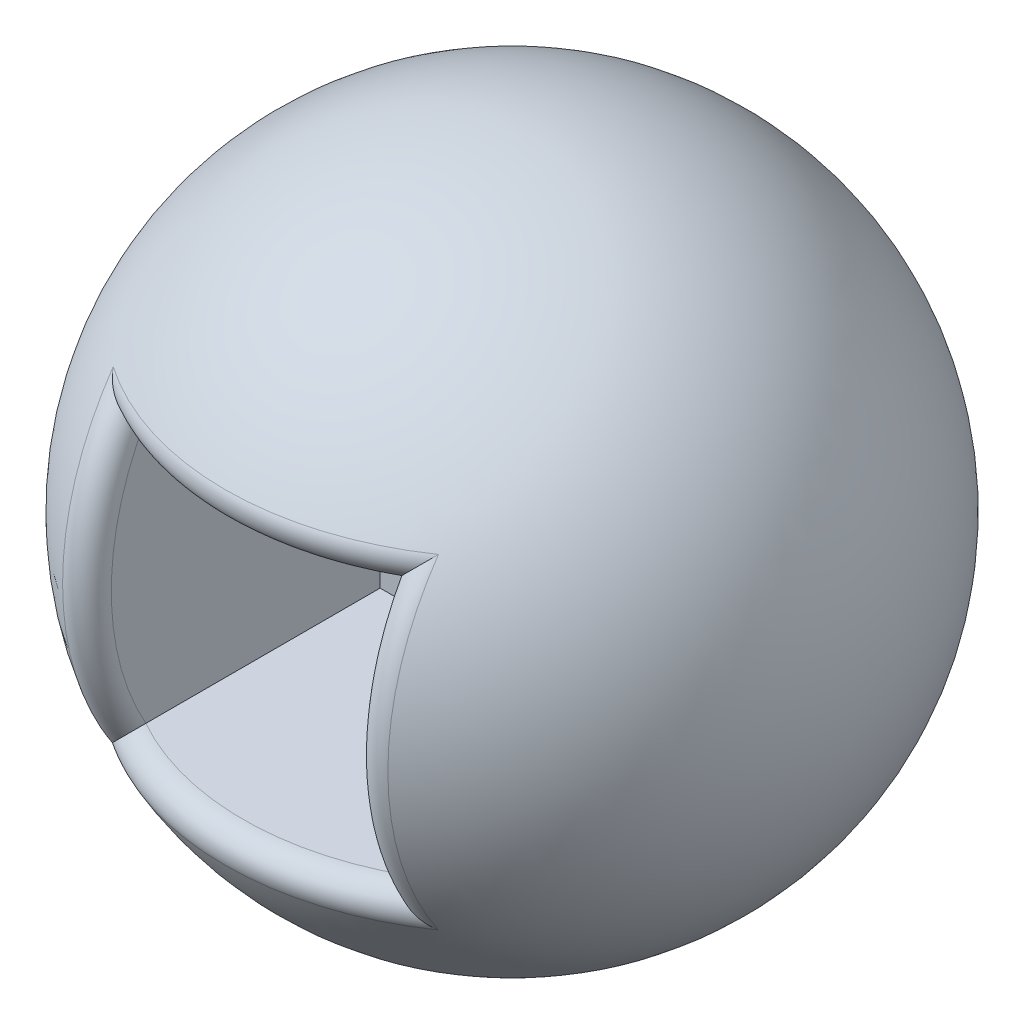
ISO-10303-21;
HEADER;
FILE_DESCRIPTION(('STEP AP214'),'2;1');
FILE_NAME('part.step','',(''),(''),'','','');
FILE_SCHEMA(('AUTOMOTIVE_DESIGN { 1 0 10303 214 1 1 1 1 }'));
ENDSEC;
DATA;
#1=APPLICATION_CONTEXT('core data for automotive mechanical design processes');
#2=APPLICATION_PROTOCOL_DEFINITION('international standard','automotive_design',2000,#1);
#3=PRODUCT_CONTEXT('',#1,'mechanical');
#4=PRODUCT('Part','Part','',(#3));
#5=PRODUCT_RELATED_PRODUCT_CATEGORY('part','',(#4));
#6=PRODUCT_DEFINITION_FORMATION('','',#4);
#7=PRODUCT_DEFINITION_CONTEXT('part definition',#1,'design');
#8=PRODUCT_DEFINITION('design','',#6,#7);
#9=PRODUCT_DEFINITION_SHAPE('','',#8);
#10=(LENGTH_UNIT() NAMED_UNIT(*) SI_UNIT(.MILLI.,.METRE.));
#11=(NAMED_UNIT(*) PLANE_ANGLE_UNIT() SI_UNIT($,.RADIAN.));
#12=(NAMED_UNIT(*) SI_UNIT($,.STERADIAN.) SOLID_ANGLE_UNIT());
#13=UNCERTAINTY_MEASURE_WITH_UNIT(LENGTH_MEASURE(1.E-05),#10,'distance_accuracy_value','');
#14=(GEOMETRIC_REPRESENTATION_CONTEXT(3) GLOBAL_UNCERTAINTY_ASSIGNED_CONTEXT((#13)) GLOBAL_UNIT_ASSIGNED_CONTEXT((#10,
#11,#12)) REPRESENTATION_CONTEXT('',''));
#15=CARTESIAN_POINT('',(0.,0.,0.));
#16=DIRECTION('',(0.,0.,1.));
#17=DIRECTION('',(1.,0.,0.));
#18=AXIS2_PLACEMENT_3D('',#15,#16,#17);
#19=CARTESIAN_POINT('',(0.,0.,0.));
#20=DIRECTION('',(0.,1.,0.));
#21=DIRECTION('',(1.,0.,0.));
#22=AXIS2_PLACEMENT_3D('',#19,#20,#21);
#23=SPHERICAL_SURFACE('',#22,8.);
#24=CARTESIAN_POINT('',(3.94666666666666,0.,0.));
#25=DIRECTION('',(-1.,0.,0.));
#26=DIRECTION('',(0.,-1.,0.));
#27=AXIS2_PLACEMENT_3D('',#24,#25,#26);
#28=CIRCLE('',#27,6.9587227435947);
#29=CARTESIAN_POINT('',(3.94666666666667,3.94666666666667,5.73128645632413));
#30=VERTEX_POINT('',#29);
#31=CARTESIAN_POINT('',(3.94666666666667,-3.94666666666667,5.73128645632413));
#32=VERTEX_POINT('',#31);
#33=EDGE_CURVE('E122',#30,#32,#28,.F.);
#34=ORIENTED_EDGE('',*,*,#33,.T.);
#35=CARTESIAN_POINT('',(0.,-3.94666666666666,0.));
#36=DIRECTION('',(0.,1.,0.));
#37=DIRECTION('',(0.,0.,1.));
#38=AXIS2_PLACEMENT_3D('',#35,#36,#37);
#39=CIRCLE('',#38,6.95872274359471);
#40=CARTESIAN_POINT('',(-3.94666666666667,-3.94666666666667,5.73128645632413));
#41=VERTEX_POINT('',#40);
#42=EDGE_CURVE('E124',#32,#41,#39,.F.);
#43=ORIENTED_EDGE('',*,*,#42,.T.);
#44=CARTESIAN_POINT('',(-3.94666666666666,0.,0.));
#45=DIRECTION('',(1.,0.,0.));
#46=DIRECTION('',(0.,0.,-1.));
#47=AXIS2_PLACEMENT_3D('',#44,#45,#46);
#48=CIRCLE('',#47,6.9587227435947);
#49=CARTESIAN_POINT('',(-3.94666666666667,3.94666666666667,5.73128645632413));
#50=VERTEX_POINT('',#49);
#51=EDGE_CURVE('E116',#41,#50,#48,.F.);
#52=ORIENTED_EDGE('',*,*,#51,.T.);
#53=CARTESIAN_POINT('',(0.,3.94666666666666,0.));
#54=DIRECTION('',(0.,-1.,0.));
#55=DIRECTION('',(0.,0.,-1.));
#56=AXIS2_PLACEMENT_3D('',#53,#54,#55);
#57=CIRCLE('',#56,6.9587227435947);
#58=EDGE_CURVE('E114',#50,#30,#57,.F.);
#59=ORIENTED_EDGE('',*,*,#58,.T.);
#60=EDGE_LOOP('',(#34,#43,#52,#59));
#61=FACE_BOUND('',#60,.T.);
#62=ADVANCED_FACE('F32',(#61),#23,.T.);
#63=CARTESIAN_POINT('',(-3.2,3.2,-9.05096679918781));
#64=DIRECTION('',(-1.,0.,0.));
#65=DIRECTION('',(0.,0.,1.));
#66=AXIS2_PLACEMENT_3D('',#63,#64,#65);
#67=PLANE('',#66);
#68=DIRECTION('',(0.,0.,1.));
#69=VECTOR('',#68,1.);
#70=CARTESIAN_POINT('',(-3.2,3.2,-9.05096679918781));
#71=LINE('',#70,#69);
#72=CARTESIAN_POINT('',(-3.2,3.2,0.));
#73=VERTEX_POINT('',#72);
#74=CARTESIAN_POINT('',(-3.2,3.2,5.68506816142076));
#75=VERTEX_POINT('',#74);
#76=EDGE_CURVE('E99',#73,#75,#71,.T.);
#77=ORIENTED_EDGE('',*,*,#76,.T.);
#78=CARTESIAN_POINT('',(-3.2,0.,0.));
#79=DIRECTION('',(-1.,0.,0.));
#80=DIRECTION('',(0.,0.,1.));
#81=AXIS2_PLACEMENT_3D('',#78,#79,#80);
#82=CIRCLE('',#81,6.52380257212004);
#83=CARTESIAN_POINT('',(-3.2,-3.2,5.68506816142076));
#84=VERTEX_POINT('',#83);
#85=EDGE_CURVE('E45',#75,#84,#82,.F.);
#86=ORIENTED_EDGE('',*,*,#85,.T.);
#87=DIRECTION('',(0.,0.,1.));
#88=VECTOR('',#87,1.);
#89=CARTESIAN_POINT('',(-3.2,-3.2,-9.05096679918781));
#90=LINE('',#89,#88);
#91=CARTESIAN_POINT('',(-3.2,-3.2,0.));
#92=VERTEX_POINT('',#91);
#93=EDGE_CURVE('E109',#92,#84,#90,.T.);
#94=ORIENTED_EDGE('',*,*,#93,.F.);
#95=DIRECTION('',(0.,1.,0.));
#96=VECTOR('',#95,1.);
#97=CARTESIAN_POINT('',(-3.2,3.2,0.));
#98=LINE('',#97,#96);
#99=EDGE_CURVE('E112',#92,#73,#98,.T.);
#100=ORIENTED_EDGE('',*,*,#99,.T.);
#101=EDGE_LOOP('',(#77,#86,#94,#100));
#102=FACE_BOUND('',#101,.T.);
#103=ADVANCED_FACE('F162',(#102),#67,.F.);
#104=CARTESIAN_POINT('',(-3.2,3.2,-9.05096679918781));
#105=DIRECTION('',(0.,1.,0.));
#106=DIRECTION('',(0.,0.,1.));
#107=AXIS2_PLACEMENT_3D('',#104,#105,#106);
#108=PLANE('',#107);
#109=DIRECTION('',(0.,0.,1.));
#110=VECTOR('',#109,1.);
#111=CARTESIAN_POINT('',(3.2,3.2,-9.05096679918781));
#112=LINE('',#111,#110);
#113=CARTESIAN_POINT('',(3.2,3.2,0.));
#114=VERTEX_POINT('',#113);
#115=CARTESIAN_POINT('',(3.2,3.2,5.68506816142076));
#116=VERTEX_POINT('',#115);
#117=EDGE_CURVE('E94',#114,#116,#112,.T.);
#118=ORIENTED_EDGE('',*,*,#117,.T.);
#119=CARTESIAN_POINT('',(0.,3.2,0.));
#120=DIRECTION('',(0.,1.,0.));
#121=DIRECTION('',(0.,0.,1.));
#122=AXIS2_PLACEMENT_3D('',#119,#120,#121);
#123=CIRCLE('',#122,6.52380257212004);
#124=EDGE_CURVE('E11',#116,#75,#123,.F.);
#125=ORIENTED_EDGE('',*,*,#124,.T.);
#126=ORIENTED_EDGE('',*,*,#76,.F.);
#127=DIRECTION('',(1.,0.,0.));
#128=VECTOR('',#127,1.);
#129=CARTESIAN_POINT('',(-3.2,3.2,0.));
#130=LINE('',#129,#128);
#131=EDGE_CURVE('E98',#73,#114,#130,.T.);
#132=ORIENTED_EDGE('',*,*,#131,.T.);
#133=EDGE_LOOP('',(#118,#125,#126,#132));
#134=FACE_BOUND('',#133,.T.);
#135=ADVANCED_FACE('F167',(#134),#108,.F.);
#136=CARTESIAN_POINT('',(3.2,3.2,-9.05096679918781));
#137=DIRECTION('',(1.,0.,0.));
#138=DIRECTION('',(0.,1.,0.));
#139=AXIS2_PLACEMENT_3D('',#136,#137,#138);
#140=PLANE('',#139);
#141=DIRECTION('',(0.,0.,1.));
#142=VECTOR('',#141,1.);
#143=CARTESIAN_POINT('',(3.2,-3.2,-9.05096679918781));
#144=LINE('',#143,#142);
#145=CARTESIAN_POINT('',(3.2,-3.2,0.));
#146=VERTEX_POINT('',#145);
#147=CARTESIAN_POINT('',(3.2,-3.2,5.68506816142075));
#148=VERTEX_POINT('',#147);
#149=EDGE_CURVE('E93',#146,#148,#144,.T.);
#150=ORIENTED_EDGE('',*,*,#149,.T.);
#151=CARTESIAN_POINT('',(3.2,0.,0.));
#152=DIRECTION('',(1.,0.,0.));
#153=DIRECTION('',(0.,1.,0.));
#154=AXIS2_PLACEMENT_3D('',#151,#152,#153);
#155=CIRCLE('',#154,6.52380257212004);
#156=EDGE_CURVE('E59',#148,#116,#155,.F.);
#157=ORIENTED_EDGE('',*,*,#156,.T.);
#158=ORIENTED_EDGE('',*,*,#117,.F.);
#159=DIRECTION('',(0.,-1.,0.));
#160=VECTOR('',#159,1.);
#161=CARTESIAN_POINT('',(3.2,3.2,0.));
#162=LINE('',#161,#160);
#163=EDGE_CURVE('E90',#114,#146,#162,.T.);
#164=ORIENTED_EDGE('',*,*,#163,.T.);
#165=EDGE_LOOP('',(#150,#157,#158,#164));
#166=FACE_BOUND('',#165,.T.);
#167=ADVANCED_FACE('F92',(#166),#140,.F.);
#168=CARTESIAN_POINT('',(-3.2,-3.2,-9.05096679918781));
#169=DIRECTION('',(0.,-1.,0.));
#170=DIRECTION('',(0.,0.,-1.));
#171=AXIS2_PLACEMENT_3D('',#168,#169,#170);
#172=PLANE('',#171);
#173=ORIENTED_EDGE('',*,*,#93,.T.);
#174=CARTESIAN_POINT('',(0.,-3.2,0.));
#175=DIRECTION('',(0.,-1.,0.));
#176=DIRECTION('',(0.,0.,-1.));
#177=AXIS2_PLACEMENT_3D('',#174,#175,#176);
#178=CIRCLE('',#177,6.52380257212004);
#179=EDGE_CURVE('E108',#84,#148,#178,.F.);
#180=ORIENTED_EDGE('',*,*,#179,.T.);
#181=ORIENTED_EDGE('',*,*,#149,.F.);
#182=DIRECTION('',(-1.,0.,0.));
#183=VECTOR('',#182,1.);
#184=CARTESIAN_POINT('',(-3.2,-3.2,0.));
#185=LINE('',#184,#183);
#186=EDGE_CURVE('E105',#146,#92,#185,.T.);
#187=ORIENTED_EDGE('',*,*,#186,.T.);
#188=EDGE_LOOP('',(#173,#180,#181,#187));
#189=FACE_BOUND('',#188,.T.);
#190=ADVANCED_FACE('F104',(#189),#172,.F.);
#191=CARTESIAN_POINT('',(0.,0.,0.));
#192=DIRECTION('',(0.,0.,1.));
#193=DIRECTION('',(1.,0.,0.));
#194=AXIS2_PLACEMENT_3D('',#191,#192,#193);
#195=PLANE('',#194);
#196=ORIENTED_EDGE('',*,*,#99,.F.);
#197=ORIENTED_EDGE('',*,*,#186,.F.);
#198=ORIENTED_EDGE('',*,*,#163,.F.);
#199=ORIENTED_EDGE('',*,*,#131,.F.);
#200=EDGE_LOOP('',(#196,#197,#198,#199));
#201=FACE_BOUND('',#200,.T.);
#202=ADVANCED_FACE('F111',(#201),#195,.T.);
#203=CARTESIAN_POINT('',(0.,3.7,0.));
#204=DIRECTION('',(0.,1.,0.));
#205=DIRECTION('',(0.,0.,1.));
#206=AXIS2_PLACEMENT_3D('',#203,#204,#205);
#207=TOROIDAL_SURFACE('',#206,6.52380257212004,0.5);
#208=CARTESIAN_POINT('',(-3.2,3.2,5.68506816142076));
#209=CARTESIAN_POINT('',(-3.19998877388912,3.19998877388912,5.70471571966132));
#210=CARTESIAN_POINT('',(-3.20087940177729,3.20087940177729,5.72442791768391));
#211=CARTESIAN_POINT('',(-3.20470889853326,3.20470889853326,5.76358738094332));
#212=CARTESIAN_POINT('',(-3.2076626817254,3.2076626817254,5.78303165909288));
#213=CARTESIAN_POINT('',(-3.21589635483217,3.21589635483217,5.82107970551348));
#214=CARTESIAN_POINT('',(-3.22119102297732,3.22119102297732,5.83967729230619));
#215=CARTESIAN_POINT('',(-3.23413197679021,3.23413197679021,5.87508579408568));
#216=CARTESIAN_POINT('',(-3.24176937568553,3.24176937568553,5.89190314325819));
#217=CARTESIAN_POINT('',(-3.25842359023605,3.25842359023605,5.9217735958257));
#218=CARTESIAN_POINT('',(-3.2672613468111,3.2672613468111,5.93502727847773));
#219=CARTESIAN_POINT('',(-3.28641241907399,3.28641241907399,5.95921901621683));
#220=CARTESIAN_POINT('',(-3.29672751659902,3.29672751659902,5.97015423489345));
#221=CARTESIAN_POINT('',(-3.31831886331062,3.31831886331062,5.989461794239));
#222=CARTESIAN_POINT('',(-3.32958288518853,3.32958288518853,5.9978617943823));
#223=CARTESIAN_POINT('',(-3.35282388665968,3.35282388665968,6.01233529235189));
#224=CARTESIAN_POINT('',(-3.36480096845578,3.36480096845578,6.0184084557407));
#225=CARTESIAN_POINT('',(-3.3960115272723,3.3960115272723,6.03119115404633));
#226=CARTESIAN_POINT('',(-3.41556128324563,3.41556128324563,6.03636124616675));
#227=CARTESIAN_POINT('',(-3.45499566141737,3.45499566141737,6.04225171967323));
#228=CARTESIAN_POINT('',(-3.47488102923742,3.47488102923742,6.04296035971914));
#229=CARTESIAN_POINT('',(-3.52395986315572,3.52395986315572,6.04010356945991));
#230=CARTESIAN_POINT('',(-3.55308737921764,3.55308737921764,6.03434772783249));
#231=CARTESIAN_POINT('',(-3.61034769105116,3.61034769105116,6.01653400938044));
#232=CARTESIAN_POINT('',(-3.63847829787442,3.63847829787442,6.0044630834765));
#233=CARTESIAN_POINT('',(-3.70608079414686,3.70608079414686,5.96850431897126));
#234=CARTESIAN_POINT('',(-3.74478495363564,3.74478495363564,5.9417333939506));
#235=CARTESIAN_POINT('',(-3.81863654427461,3.81863654427461,5.87995615858693));
#236=CARTESIAN_POINT('',(-3.85378603141626,3.85378603141626,5.84495464815359));
#237=CARTESIAN_POINT('',(-3.90678318267857,3.90678318267857,5.78375765630128));
#238=CARTESIAN_POINT('',(-3.92588963296566,3.92588963296566,5.75970714651252));
#239=CARTESIAN_POINT('',(-3.94506222555609,3.94506222555609,5.7334921599564));
#240=CARTESIAN_POINT('',(-3.94586515568621,3.94586515568621,5.73239032389124));
#241=CARTESIAN_POINT('',(-3.94666666666667,3.94666666666667,5.73128645632413));
#242=B_SPLINE_CURVE_WITH_KNOTS('',3,(#208,#209,#210,#211,#212,#213,#214,#215,#216,#217,#218,
#219,#220,#221,#222,#223,#224,#225,#226,#227,#228,#229,#230,#231,#232,#233,#234,#235,#236,#237,
#238,#239,#240,#241),.UNSPECIFIED.,.F.,.F.,(4,2,2,2,2,2,2,2,2,2,2,2,2,2,2,2,4),(0.,
0.0590000504784811,0.118431080398611,0.178242784065217,0.237830350157615,0.292206499537093,
0.346648793698302,0.400473649713155,0.454306239104105,0.538208721022339,0.622331919690956,
0.746419435929735,0.870764377212627,1.05258292318277,1.23429569810298,1.34269176483334,
1.34743842948584),.UNSPECIFIED.);
#243=EDGE_CURVE('E240',#75,#50,#242,.T.);
#244=ORIENTED_EDGE('',*,*,#243,.F.);
#245=ORIENTED_EDGE('',*,*,#124,.F.);
#246=CARTESIAN_POINT('',(3.2,3.2,5.68506816142076));
#247=CARTESIAN_POINT('',(3.19998877388912,3.19998877388912,5.70471571966132));
#248=CARTESIAN_POINT('',(3.20087940177729,3.20087940177729,5.72442791768391));
#249=CARTESIAN_POINT('',(3.20470889853326,3.20470889853326,5.76358738094332));
#250=CARTESIAN_POINT('',(3.2076626817254,3.2076626817254,5.78303165909288));
#251=CARTESIAN_POINT('',(3.21589635483217,3.21589635483217,5.82107970551348));
#252=CARTESIAN_POINT('',(3.22119102297732,3.22119102297732,5.83967729230619));
#253=CARTESIAN_POINT('',(3.23413197679021,3.23413197679021,5.87508579408568));
#254=CARTESIAN_POINT('',(3.24176937568553,3.24176937568553,5.89190314325819));
#255=CARTESIAN_POINT('',(3.25842359023605,3.25842359023605,5.9217735958257));
#256=CARTESIAN_POINT('',(3.2672613468111,3.2672613468111,5.93502727847773));
#257=CARTESIAN_POINT('',(3.28641241907399,3.28641241907399,5.95921901621683));
#258=CARTESIAN_POINT('',(3.29672751659902,3.29672751659902,5.97015423489345));
#259=CARTESIAN_POINT('',(3.31831886331062,3.31831886331062,5.98946179423901));
#260=CARTESIAN_POINT('',(3.32958288518854,3.32958288518853,5.9978617943823));
#261=CARTESIAN_POINT('',(3.35282388665968,3.35282388665968,6.01233529235189));
#262=CARTESIAN_POINT('',(3.36480096845578,3.36480096845578,6.01840845574069));
#263=CARTESIAN_POINT('',(3.3960115272723,3.3960115272723,6.03119115404633));
#264=CARTESIAN_POINT('',(3.41556128324563,3.41556128324563,6.03636124616676));
#265=CARTESIAN_POINT('',(3.45499566141737,3.45499566141737,6.04225171967323));
#266=CARTESIAN_POINT('',(3.47488102923742,3.47488102923742,6.04296035971914));
#267=CARTESIAN_POINT('',(3.52395986315573,3.52395986315572,6.04010356945991));
#268=CARTESIAN_POINT('',(3.55308737921764,3.55308737921764,6.03434772783249));
#269=CARTESIAN_POINT('',(3.61034769105116,3.61034769105116,6.01653400938044));
#270=CARTESIAN_POINT('',(3.63847829787442,3.63847829787442,6.0044630834765));
#271=CARTESIAN_POINT('',(3.70608079414686,3.70608079414686,5.96850431897126));
#272=CARTESIAN_POINT('',(3.74478495363564,3.74478495363564,5.9417333939506));
#273=CARTESIAN_POINT('',(3.81863654427462,3.81863654427461,5.87995615858692));
#274=CARTESIAN_POINT('',(3.85378603141627,3.85378603141625,5.84495464815359));
#275=CARTESIAN_POINT('',(3.90678318267857,3.90678318267858,5.78375765630128));
#276=CARTESIAN_POINT('',(3.92588963296564,3.92588963296568,5.75970714651252));
#277=CARTESIAN_POINT('',(3.94506222555608,3.94506222555609,5.7334921599564));
#278=CARTESIAN_POINT('',(3.94586515568621,3.94586515568621,5.73239032389124));
#279=CARTESIAN_POINT('',(3.94666666666667,3.94666666666666,5.73128645632413));
#280=B_SPLINE_CURVE_WITH_KNOTS('',3,(#246,#247,#248,#249,#250,#251,#252,#253,#254,#255,#256,
#257,#258,#259,#260,#261,#262,#263,#264,#265,#266,#267,#268,#269,#270,#271,#272,#273,#274,#275,
#276,#277,#278,#279),.UNSPECIFIED.,.F.,.F.,(4,2,2,2,2,2,2,2,2,2,2,2,2,2,2,2,4),(0.,
0.0590000504784811,0.118431080398611,0.178242784065218,0.237830350157615,0.292206499537093,
0.346648793698304,0.400473649713156,0.454306239104105,0.538208721022339,0.622331919690957,
0.746419435929735,0.870764377212628,1.05258292318277,1.23429569810298,1.34269176483334,
1.34743842948584),.UNSPECIFIED.);
#281=EDGE_CURVE('E37',#30,#116,#280,.F.);
#282=ORIENTED_EDGE('',*,*,#281,.F.);
#283=ORIENTED_EDGE('',*,*,#58,.F.);
#284=EDGE_LOOP('',(#244,#245,#282,#283));
#285=FACE_BOUND('',#284,.T.);
#286=ADVANCED_FACE('F34',(#285),#207,.T.);
#287=CARTESIAN_POINT('',(3.7,0.,0.));
#288=DIRECTION('',(1.,0.,0.));
#289=DIRECTION('',(0.,1.,0.));
#290=AXIS2_PLACEMENT_3D('',#287,#288,#289);
#291=TOROIDAL_SURFACE('',#290,6.52380257212004,0.5);
#292=ORIENTED_EDGE('',*,*,#281,.T.);
#293=ORIENTED_EDGE('',*,*,#156,.F.);
#294=CARTESIAN_POINT('',(3.2,-3.2,5.68506816142076));
#295=CARTESIAN_POINT('',(3.19998877388912,-3.19998877388912,5.70471571966132));
#296=CARTESIAN_POINT('',(3.20087940177729,-3.20087940177729,5.72442791768391));
#297=CARTESIAN_POINT('',(3.20470889853326,-3.20470889853326,5.76358738094332));
#298=CARTESIAN_POINT('',(3.2076626817254,-3.2076626817254,5.78303165909288));
#299=CARTESIAN_POINT('',(3.21589635483217,-3.21589635483217,5.82107970551348));
#300=CARTESIAN_POINT('',(3.22119102297732,-3.22119102297732,5.83967729230619));
#301=CARTESIAN_POINT('',(3.23413197679021,-3.23413197679021,5.87508579408568));
#302=CARTESIAN_POINT('',(3.24176937568553,-3.24176937568553,5.89190314325819));
#303=CARTESIAN_POINT('',(3.25842359023605,-3.25842359023605,5.9217735958257));
#304=CARTESIAN_POINT('',(3.2672613468111,-3.2672613468111,5.93502727847773));
#305=CARTESIAN_POINT('',(3.28641241907399,-3.28641241907399,5.95921901621683));
#306=CARTESIAN_POINT('',(3.29672751659902,-3.29672751659902,5.97015423489345));
#307=CARTESIAN_POINT('',(3.31831886331063,-3.31831886331062,5.989461794239));
#308=CARTESIAN_POINT('',(3.32958288518854,-3.32958288518854,5.99786179438229));
#309=CARTESIAN_POINT('',(3.35282388665968,-3.35282388665968,6.01233529235189));
#310=CARTESIAN_POINT('',(3.36480096845578,-3.36480096845578,6.01840845574069));
#311=CARTESIAN_POINT('',(3.3960115272723,-3.3960115272723,6.03119115404633));
#312=CARTESIAN_POINT('',(3.41556128324563,-3.41556128324563,6.03636124616675));
#313=CARTESIAN_POINT('',(3.45499566141737,-3.45499566141737,6.04225171967323));
#314=CARTESIAN_POINT('',(3.47488102923742,-3.47488102923742,6.04296035971914));
#315=CARTESIAN_POINT('',(3.52395986315573,-3.52395986315573,6.04010356945991));
#316=CARTESIAN_POINT('',(3.55308737921765,-3.55308737921764,6.03434772783248));
#317=CARTESIAN_POINT('',(3.61034769105116,-3.61034769105117,6.01653400938043));
#318=CARTESIAN_POINT('',(3.63847829787441,-3.63847829787444,6.0044630834765));
#319=CARTESIAN_POINT('',(3.70608079414688,-3.70608079414684,5.96850431897126));
#320=CARTESIAN_POINT('',(3.74478495363573,-3.74478495363555,5.9417333939506));
#321=CARTESIAN_POINT('',(3.81863654427452,-3.8186365442747,5.87995615858692));
#322=CARTESIAN_POINT('',(3.85378603141592,-3.8537860314166,5.84495464815358));
#323=CARTESIAN_POINT('',(3.90678318267878,-3.90678318267838,5.78375765630128));
#324=CARTESIAN_POINT('',(3.92588963296628,-3.92588963296505,5.75970714651252));
#325=CARTESIAN_POINT('',(3.94506222555614,-3.94506222555603,5.7334921599564));
#326=CARTESIAN_POINT('',(3.94586515568624,-3.94586515568619,5.73239032389124));
#327=CARTESIAN_POINT('',(3.94666666666667,-3.94666666666666,5.73128645632413));
#328=B_SPLINE_CURVE_WITH_KNOTS('',3,(#294,#295,#296,#297,#298,#299,#300,#301,#302,#303,#304,
#305,#306,#307,#308,#309,#310,#311,#312,#313,#314,#315,#316,#317,#318,#319,#320,#321,#322,#323,
#324,#325,#326,#327),.UNSPECIFIED.,.F.,.F.,(4,2,2,2,2,2,2,2,2,2,2,2,2,2,2,2,4),(0.,
0.0590000504784811,0.118431080398611,0.178242784065218,0.237830350157616,0.292206499537092,
0.346648793698304,0.400473649713156,0.454306239104105,0.538208721022339,0.622331919690958,
0.746419435929738,0.87076437721263,1.05258292318277,1.23429569810299,1.34269176483334,
1.34743842948583),.UNSPECIFIED.);
#329=EDGE_CURVE('E137',#32,#148,#328,.F.);
#330=ORIENTED_EDGE('',*,*,#329,.F.);
#331=ORIENTED_EDGE('',*,*,#33,.F.);
#332=EDGE_LOOP('',(#292,#293,#330,#331));
#333=FACE_BOUND('',#332,.T.);
#334=ADVANCED_FACE('F148',(#333),#291,.T.);
#335=CARTESIAN_POINT('',(-3.7,0.,0.));
#336=DIRECTION('',(-1.,0.,0.));
#337=DIRECTION('',(0.,0.,1.));
#338=AXIS2_PLACEMENT_3D('',#335,#336,#337);
#339=TOROIDAL_SURFACE('',#338,6.52380257212004,0.5);
#340=ORIENTED_EDGE('',*,*,#243,.T.);
#341=ORIENTED_EDGE('',*,*,#51,.F.);
#342=CARTESIAN_POINT('',(-3.2,-3.2,5.68506816142076));
#343=CARTESIAN_POINT('',(-3.19998877388912,-3.19998877388912,5.70471571966132));
#344=CARTESIAN_POINT('',(-3.20087940177729,-3.20087940177729,5.72442791768391));
#345=CARTESIAN_POINT('',(-3.20470889853326,-3.20470889853326,5.76358738094332));
#346=CARTESIAN_POINT('',(-3.2076626817254,-3.2076626817254,5.78303165909288));
#347=CARTESIAN_POINT('',(-3.21589635483217,-3.21589635483217,5.82107970551348));
#348=CARTESIAN_POINT('',(-3.22119102297732,-3.22119102297732,5.83967729230619));
#349=CARTESIAN_POINT('',(-3.23413197679021,-3.23413197679021,5.87508579408568));
#350=CARTESIAN_POINT('',(-3.24176937568553,-3.24176937568553,5.89190314325819));
#351=CARTESIAN_POINT('',(-3.25842359023605,-3.25842359023605,5.9217735958257));
#352=CARTESIAN_POINT('',(-3.2672613468111,-3.2672613468111,5.93502727847773));
#353=CARTESIAN_POINT('',(-3.28641241907399,-3.28641241907399,5.95921901621683));
#354=CARTESIAN_POINT('',(-3.29672751659902,-3.29672751659902,5.97015423489345));
#355=CARTESIAN_POINT('',(-3.31831886331062,-3.31831886331062,5.989461794239));
#356=CARTESIAN_POINT('',(-3.32958288518853,-3.32958288518853,5.9978617943823));
#357=CARTESIAN_POINT('',(-3.35282388665968,-3.35282388665968,6.01233529235189));
#358=CARTESIAN_POINT('',(-3.36480096845578,-3.36480096845578,6.0184084557407));
#359=CARTESIAN_POINT('',(-3.3960115272723,-3.3960115272723,6.03119115404633));
#360=CARTESIAN_POINT('',(-3.41556128324563,-3.41556128324563,6.03636124616675));
#361=CARTESIAN_POINT('',(-3.45499566141737,-3.45499566141737,6.04225171967323));
#362=CARTESIAN_POINT('',(-3.47488102923742,-3.47488102923742,6.04296035971914));
#363=CARTESIAN_POINT('',(-3.52395986315572,-3.52395986315572,6.04010356945991));
#364=CARTESIAN_POINT('',(-3.55308737921764,-3.55308737921764,6.03434772783249));
#365=CARTESIAN_POINT('',(-3.61034769105116,-3.61034769105116,6.01653400938044));
#366=CARTESIAN_POINT('',(-3.63847829787442,-3.63847829787442,6.0044630834765));
#367=CARTESIAN_POINT('',(-3.70608079414686,-3.70608079414686,5.96850431897126));
#368=CARTESIAN_POINT('',(-3.74478495363564,-3.74478495363564,5.9417333939506));
#369=CARTESIAN_POINT('',(-3.81863654427461,-3.81863654427461,5.87995615858693));
#370=CARTESIAN_POINT('',(-3.85378603141626,-3.85378603141626,5.84495464815359));
#371=CARTESIAN_POINT('',(-3.90678318267857,-3.90678318267857,5.78375765630128));
#372=CARTESIAN_POINT('',(-3.92588963296566,-3.92588963296566,5.75970714651252));
#373=CARTESIAN_POINT('',(-3.94506222555609,-3.94506222555609,5.7334921599564));
#374=CARTESIAN_POINT('',(-3.94586515568621,-3.94586515568621,5.73239032389124));
#375=CARTESIAN_POINT('',(-3.94666666666667,-3.94666666666667,5.73128645632413));
#376=B_SPLINE_CURVE_WITH_KNOTS('',3,(#342,#343,#344,#345,#346,#347,#348,#349,#350,#351,#352,
#353,#354,#355,#356,#357,#358,#359,#360,#361,#362,#363,#364,#365,#366,#367,#368,#369,#370,#371,
#372,#373,#374,#375),.UNSPECIFIED.,.F.,.F.,(4,2,2,2,2,2,2,2,2,2,2,2,2,2,2,2,4),(0.,
0.0590000504784811,0.118431080398611,0.178242784065217,0.237830350157615,0.292206499537093,
0.346648793698302,0.400473649713155,0.454306239104105,0.538208721022339,0.622331919690956,
0.746419435929735,0.870764377212627,1.05258292318277,1.23429569810298,1.34269176483334,
1.34743842948584),.UNSPECIFIED.);
#377=EDGE_CURVE('E130',#84,#41,#376,.T.);
#378=ORIENTED_EDGE('',*,*,#377,.F.);
#379=ORIENTED_EDGE('',*,*,#85,.F.);
#380=EDGE_LOOP('',(#340,#341,#378,#379));
#381=FACE_BOUND('',#380,.T.);
#382=ADVANCED_FACE('F141',(#381),#339,.T.);
#383=CARTESIAN_POINT('',(0.,-3.7,0.));
#384=DIRECTION('',(0.,-1.,0.));
#385=DIRECTION('',(0.,0.,-1.));
#386=AXIS2_PLACEMENT_3D('',#383,#384,#385);
#387=TOROIDAL_SURFACE('',#386,6.52380257212004,0.5);
#388=ORIENTED_EDGE('',*,*,#329,.T.);
#389=ORIENTED_EDGE('',*,*,#179,.F.);
#390=ORIENTED_EDGE('',*,*,#377,.T.);
#391=ORIENTED_EDGE('',*,*,#42,.F.);
#392=EDGE_LOOP('',(#388,#389,#390,#391));
#393=FACE_BOUND('',#392,.T.);
#394=ADVANCED_FACE('F144',(#393),#387,.T.);
#395=CLOSED_SHELL('',(#62,#103,#135,#167,#190,#202,#286,#334,#382,#394));
#396=MANIFOLD_SOLID_BREP('B2',#395);
#397=ADVANCED_BREP_SHAPE_REPRESENTATION('',(#18,#396),#14);
#398=SHAPE_DEFINITION_REPRESENTATION(#9,#397);
ENDSEC;
END-ISO-10303-21;
